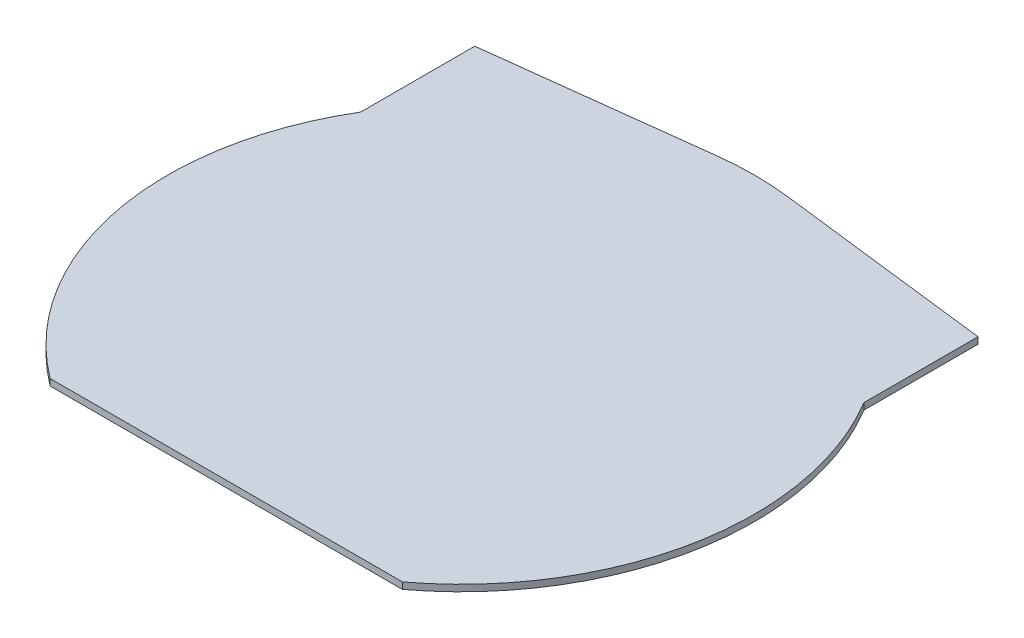
ISO-10303-21;
HEADER;
FILE_DESCRIPTION(('STEP AP214'),'2;1');
FILE_NAME('part.step','',(''),(''),'','','');
FILE_SCHEMA(('AUTOMOTIVE_DESIGN { 1 0 10303 214 1 1 1 1 }'));
ENDSEC;
DATA;
#1=APPLICATION_CONTEXT('core data for automotive mechanical design processes');
#2=APPLICATION_PROTOCOL_DEFINITION('international standard','automotive_design',2000,#1);
#3=PRODUCT_CONTEXT('',#1,'mechanical');
#4=PRODUCT('Part','Part','',(#3));
#5=PRODUCT_RELATED_PRODUCT_CATEGORY('part','',(#4));
#6=PRODUCT_DEFINITION_FORMATION('','',#4);
#7=PRODUCT_DEFINITION_CONTEXT('part definition',#1,'design');
#8=PRODUCT_DEFINITION('design','',#6,#7);
#9=PRODUCT_DEFINITION_SHAPE('','',#8);
#10=(LENGTH_UNIT() NAMED_UNIT(*) SI_UNIT(.MILLI.,.METRE.));
#11=(NAMED_UNIT(*) PLANE_ANGLE_UNIT() SI_UNIT($,.RADIAN.));
#12=(NAMED_UNIT(*) SI_UNIT($,.STERADIAN.) SOLID_ANGLE_UNIT());
#13=UNCERTAINTY_MEASURE_WITH_UNIT(LENGTH_MEASURE(1.E-05),#10,'distance_accuracy_value','');
#14=(GEOMETRIC_REPRESENTATION_CONTEXT(3) GLOBAL_UNCERTAINTY_ASSIGNED_CONTEXT((#13)) GLOBAL_UNIT_ASSIGNED_CONTEXT((#10,
#11,#12)) REPRESENTATION_CONTEXT('',''));
#15=CARTESIAN_POINT('',(0.,0.,0.));
#16=DIRECTION('',(0.,0.,1.));
#17=DIRECTION('',(1.,0.,0.));
#18=AXIS2_PLACEMENT_3D('',#15,#16,#17);
#19=CARTESIAN_POINT('',(0.,1.,0.));
#20=DIRECTION('',(0.,-1.,0.));
#21=DIRECTION('',(0.,0.,-1.));
#22=AXIS2_PLACEMENT_3D('',#19,#20,#21);
#23=CYLINDRICAL_SURFACE('',#22,90.);
#24=CARTESIAN_POINT('',(0.,1.,0.));
#25=DIRECTION('',(0.,1.,0.));
#26=DIRECTION('',(0.,0.,1.));
#27=AXIS2_PLACEMENT_3D('',#24,#25,#26);
#28=CIRCLE('',#27,90.);
#29=CARTESIAN_POINT('',(-77.1456828431538,1.,-46.3523852532264));
#30=VERTEX_POINT('',#29);
#31=CARTESIAN_POINT('',(-54.,1.,72.));
#32=VERTEX_POINT('',#31);
#33=EDGE_CURVE('E134',#30,#32,#28,.T.);
#34=ORIENTED_EDGE('',*,*,#33,.F.);
#35=DIRECTION('',(0.,-1.,0.));
#36=VECTOR('',#35,1.);
#37=CARTESIAN_POINT('',(-77.1456828431538,1.,-46.3523852532264));
#38=LINE('',#37,#36);
#39=CARTESIAN_POINT('',(-77.1456828431538,-1.,-46.3523852532264));
#40=VERTEX_POINT('',#39);
#41=EDGE_CURVE('E125',#30,#40,#38,.T.);
#42=ORIENTED_EDGE('',*,*,#41,.T.);
#43=CARTESIAN_POINT('',(0.,-1.,0.));
#44=DIRECTION('',(0.,1.,0.));
#45=DIRECTION('',(0.,0.,1.));
#46=AXIS2_PLACEMENT_3D('',#43,#44,#45);
#47=CIRCLE('',#46,90.);
#48=CARTESIAN_POINT('',(-54.,-1.,72.));
#49=VERTEX_POINT('',#48);
#50=EDGE_CURVE('E128',#40,#49,#47,.T.);
#51=ORIENTED_EDGE('',*,*,#50,.T.);
#52=DIRECTION('',(0.,-1.,0.));
#53=VECTOR('',#52,1.);
#54=CARTESIAN_POINT('',(-54.,1.,72.));
#55=LINE('',#54,#53);
#56=EDGE_CURVE('E143',#32,#49,#55,.T.);
#57=ORIENTED_EDGE('',*,*,#56,.F.);
#58=EDGE_LOOP('',(#34,#42,#51,#57));
#59=FACE_BOUND('',#58,.T.);
#60=ADVANCED_FACE('F35',(#59),#23,.T.);
#61=CARTESIAN_POINT('',(10.8516103197565,1.,-89.3433968095469));
#62=VERTEX_POINT('',#61);
#63=CARTESIAN_POINT('',(-10.8516103197565,1.,-89.3433968095469));
#64=VERTEX_POINT('',#63);
#65=EDGE_CURVE('E133',#62,#64,#28,.T.);
#66=ORIENTED_EDGE('',*,*,#65,.F.);
#67=DIRECTION('',(0.,-1.,0.));
#68=VECTOR('',#67,1.);
#69=CARTESIAN_POINT('',(10.8516103197565,1.,-89.3433968095469));
#70=LINE('',#69,#68);
#71=CARTESIAN_POINT('',(10.8516103197565,-1.,-89.3433968095469));
#72=VERTEX_POINT('',#71);
#73=EDGE_CURVE('E106',#62,#72,#70,.T.);
#74=ORIENTED_EDGE('',*,*,#73,.T.);
#75=CARTESIAN_POINT('',(-10.8516103197565,-1.,-89.3433968095469));
#76=VERTEX_POINT('',#75);
#77=EDGE_CURVE('E104',#72,#76,#47,.T.);
#78=ORIENTED_EDGE('',*,*,#77,.T.);
#79=DIRECTION('',(0.,-1.,0.));
#80=VECTOR('',#79,1.);
#81=CARTESIAN_POINT('',(-10.8516103197565,1.,-89.3433968095469));
#82=LINE('',#81,#80);
#83=EDGE_CURVE('E146',#76,#64,#82,.F.);
#84=ORIENTED_EDGE('',*,*,#83,.T.);
#85=EDGE_LOOP('',(#66,#74,#78,#84));
#86=FACE_BOUND('',#85,.T.);
#87=ADVANCED_FACE('F165',(#86),#23,.T.);
#88=CARTESIAN_POINT('',(54.,-1.,72.));
#89=VERTEX_POINT('',#88);
#90=CARTESIAN_POINT('',(77.1456828431538,-1.,-46.3523852532264));
#91=VERTEX_POINT('',#90);
#92=EDGE_CURVE('E137',#89,#91,#47,.T.);
#93=ORIENTED_EDGE('',*,*,#92,.T.);
#94=DIRECTION('',(0.,-1.,0.));
#95=VECTOR('',#94,1.);
#96=CARTESIAN_POINT('',(77.1456828431538,1.,-46.3523852532264));
#97=LINE('',#96,#95);
#98=CARTESIAN_POINT('',(77.1456828431538,1.,-46.3523852532264));
#99=VERTEX_POINT('',#98);
#100=EDGE_CURVE('E114',#91,#99,#97,.F.);
#101=ORIENTED_EDGE('',*,*,#100,.T.);
#102=CARTESIAN_POINT('',(54.,1.,72.));
#103=VERTEX_POINT('',#102);
#104=EDGE_CURVE('E129',#103,#99,#28,.T.);
#105=ORIENTED_EDGE('',*,*,#104,.F.);
#106=DIRECTION('',(0.,-1.,0.));
#107=VECTOR('',#106,1.);
#108=CARTESIAN_POINT('',(54.,1.,72.));
#109=LINE('',#108,#107);
#110=EDGE_CURVE('E136',#103,#89,#109,.T.);
#111=ORIENTED_EDGE('',*,*,#110,.T.);
#112=EDGE_LOOP('',(#93,#101,#105,#111));
#113=FACE_BOUND('',#112,.T.);
#114=ADVANCED_FACE('F176',(#113),#23,.T.);
#115=CARTESIAN_POINT('',(-54.,1.,72.));
#116=DIRECTION('',(0.,0.,-1.));
#117=DIRECTION('',(-1.,0.,0.));
#118=AXIS2_PLACEMENT_3D('',#115,#116,#117);
#119=PLANE('',#118);
#120=DIRECTION('',(1.,0.,0.));
#121=VECTOR('',#120,1.);
#122=CARTESIAN_POINT('',(-54.,-1.,72.));
#123=LINE('',#122,#121);
#124=EDGE_CURVE('E139',#49,#89,#123,.T.);
#125=ORIENTED_EDGE('',*,*,#124,.T.);
#126=ORIENTED_EDGE('',*,*,#110,.F.);
#127=DIRECTION('',(1.,0.,0.));
#128=VECTOR('',#127,1.);
#129=CARTESIAN_POINT('',(-54.,1.,72.));
#130=LINE('',#129,#128);
#131=EDGE_CURVE('E132',#32,#103,#130,.T.);
#132=ORIENTED_EDGE('',*,*,#131,.F.);
#133=ORIENTED_EDGE('',*,*,#56,.T.);
#134=EDGE_LOOP('',(#125,#126,#132,#133));
#135=FACE_BOUND('',#134,.T.);
#136=ADVANCED_FACE('F173',(#135),#119,.F.);
#137=CARTESIAN_POINT('',(0.,1.,0.));
#138=DIRECTION('',(0.,1.,0.));
#139=DIRECTION('',(0.,0.,1.));
#140=AXIS2_PLACEMENT_3D('',#137,#138,#139);
#141=PLANE('',#140);
#142=ORIENTED_EDGE('',*,*,#104,.T.);
#143=DIRECTION('',(0.,0.,-1.));
#144=VECTOR('',#143,1.);
#145=CARTESIAN_POINT('',(77.1456828431538,1.,-81.328780021929));
#146=LINE('',#145,#144);
#147=CARTESIAN_POINT('',(77.1456828431538,1.,-81.328780021929));
#148=VERTEX_POINT('',#147);
#149=EDGE_CURVE('E162',#99,#148,#146,.T.);
#150=ORIENTED_EDGE('',*,*,#149,.T.);
#151=CARTESIAN_POINT('',(7245.25849015743,1.,-59651.6079365075));
#152=DIRECTION('',(0.,1.,0.));
#153=DIRECTION('',(0.,0.,1.));
#154=AXIS2_PLACEMENT_3D('',#151,#152,#153);
#155=CIRCLE('',#154,60000.);
#156=EDGE_CURVE('E105',#148,#62,#155,.F.);
#157=ORIENTED_EDGE('',*,*,#156,.T.);
#158=ORIENTED_EDGE('',*,*,#65,.T.);
#159=CARTESIAN_POINT('',(-7245.25849015743,1.,-59651.6079365075));
#160=DIRECTION('',(0.,1.,0.));
#161=DIRECTION('',(0.,0.,1.));
#162=AXIS2_PLACEMENT_3D('',#159,#160,#161);
#163=CIRCLE('',#162,60000.);
#164=CARTESIAN_POINT('',(-77.1456828431538,1.,-81.328780021929));
#165=VERTEX_POINT('',#164);
#166=EDGE_CURVE('E43',#64,#165,#163,.F.);
#167=ORIENTED_EDGE('',*,*,#166,.T.);
#168=DIRECTION('',(0.,0.,1.));
#169=VECTOR('',#168,1.);
#170=CARTESIAN_POINT('',(-77.1456828431538,1.,-81.328780021929));
#171=LINE('',#170,#169);
#172=EDGE_CURVE('E154',#165,#30,#171,.T.);
#173=ORIENTED_EDGE('',*,*,#172,.T.);
#174=ORIENTED_EDGE('',*,*,#33,.T.);
#175=ORIENTED_EDGE('',*,*,#131,.T.);
#176=EDGE_LOOP('',(#142,#150,#157,#158,#167,#173,#174,#175));
#177=FACE_BOUND('',#176,.T.);
#178=ADVANCED_FACE('F153',(#177),#141,.T.);
#179=CARTESIAN_POINT('',(0.,-1.,0.));
#180=DIRECTION('',(0.,1.,0.));
#181=DIRECTION('',(0.,0.,1.));
#182=AXIS2_PLACEMENT_3D('',#179,#180,#181);
#183=PLANE('',#182);
#184=ORIENTED_EDGE('',*,*,#77,.F.);
#185=CARTESIAN_POINT('',(7245.25849015743,-1.,-59651.6079365075));
#186=DIRECTION('',(0.,1.,0.));
#187=DIRECTION('',(0.,0.,1.));
#188=AXIS2_PLACEMENT_3D('',#185,#186,#187);
#189=CIRCLE('',#188,60000.);
#190=CARTESIAN_POINT('',(77.1456828431538,-1.,-81.328780021929));
#191=VERTEX_POINT('',#190);
#192=EDGE_CURVE('E56',#72,#191,#189,.T.);
#193=ORIENTED_EDGE('',*,*,#192,.T.);
#194=DIRECTION('',(0.,0.,-1.));
#195=VECTOR('',#194,1.);
#196=CARTESIAN_POINT('',(77.1456828431538,-1.,-81.328780021929));
#197=LINE('',#196,#195);
#198=EDGE_CURVE('E102',#91,#191,#197,.T.);
#199=ORIENTED_EDGE('',*,*,#198,.F.);
#200=ORIENTED_EDGE('',*,*,#92,.F.);
#201=ORIENTED_EDGE('',*,*,#124,.F.);
#202=ORIENTED_EDGE('',*,*,#50,.F.);
#203=DIRECTION('',(0.,0.,1.));
#204=VECTOR('',#203,1.);
#205=CARTESIAN_POINT('',(-77.1456828431538,-1.,-81.328780021929));
#206=LINE('',#205,#204);
#207=CARTESIAN_POINT('',(-77.1456828431538,-1.,-81.328780021929));
#208=VERTEX_POINT('',#207);
#209=EDGE_CURVE('E115',#208,#40,#206,.T.);
#210=ORIENTED_EDGE('',*,*,#209,.F.);
#211=CARTESIAN_POINT('',(-7245.25849015743,-1.,-59651.6079365075));
#212=DIRECTION('',(0.,1.,0.));
#213=DIRECTION('',(0.,0.,1.));
#214=AXIS2_PLACEMENT_3D('',#211,#212,#213);
#215=CIRCLE('',#214,60000.);
#216=EDGE_CURVE('E11',#208,#76,#215,.T.);
#217=ORIENTED_EDGE('',*,*,#216,.T.);
#218=EDGE_LOOP('',(#184,#193,#199,#200,#201,#202,#210,#217));
#219=FACE_BOUND('',#218,.T.);
#220=ADVANCED_FACE('F100',(#219),#183,.F.);
#221=CARTESIAN_POINT('',(-77.1456828431538,-1.,-81.328780021929));
#222=DIRECTION('',(-1.,0.,0.));
#223=DIRECTION('',(0.,0.,1.));
#224=AXIS2_PLACEMENT_3D('',#221,#222,#223);
#225=PLANE('',#224);
#226=ORIENTED_EDGE('',*,*,#41,.F.);
#227=ORIENTED_EDGE('',*,*,#172,.F.);
#228=DIRECTION('',(0.,1.,0.));
#229=VECTOR('',#228,1.);
#230=CARTESIAN_POINT('',(-77.1456828431538,-1.,-81.328780021929));
#231=LINE('',#230,#229);
#232=EDGE_CURVE('E118',#208,#165,#231,.T.);
#233=ORIENTED_EDGE('',*,*,#232,.F.);
#234=ORIENTED_EDGE('',*,*,#209,.T.);
#235=EDGE_LOOP('',(#226,#227,#233,#234));
#236=FACE_BOUND('',#235,.T.);
#237=ADVANCED_FACE('F160',(#236),#225,.T.);
#238=CARTESIAN_POINT('',(77.1456828431538,-1.,-81.328780021929));
#239=DIRECTION('',(1.,0.,0.));
#240=DIRECTION('',(0.,0.,-1.));
#241=AXIS2_PLACEMENT_3D('',#238,#239,#240);
#242=PLANE('',#241);
#243=ORIENTED_EDGE('',*,*,#100,.F.);
#244=ORIENTED_EDGE('',*,*,#198,.T.);
#245=DIRECTION('',(0.,1.,0.));
#246=VECTOR('',#245,1.);
#247=CARTESIAN_POINT('',(77.1456828431538,-1.,-81.328780021929));
#248=LINE('',#247,#246);
#249=EDGE_CURVE('E111',#191,#148,#248,.T.);
#250=ORIENTED_EDGE('',*,*,#249,.T.);
#251=ORIENTED_EDGE('',*,*,#149,.F.);
#252=EDGE_LOOP('',(#243,#244,#250,#251));
#253=FACE_BOUND('',#252,.T.);
#254=ADVANCED_FACE('F110',(#253),#242,.T.);
#255=CARTESIAN_POINT('',(7245.25849015743,-1.,-59651.6079365075));
#256=DIRECTION('',(0.,1.,0.));
#257=DIRECTION('',(0.,0.,1.));
#258=AXIS2_PLACEMENT_3D('',#255,#256,#257);
#259=CYLINDRICAL_SURFACE('',#258,60000.);
#260=ORIENTED_EDGE('',*,*,#156,.F.);
#261=ORIENTED_EDGE('',*,*,#249,.F.);
#262=ORIENTED_EDGE('',*,*,#192,.F.);
#263=ORIENTED_EDGE('',*,*,#73,.F.);
#264=EDGE_LOOP('',(#260,#261,#262,#263));
#265=FACE_BOUND('',#264,.T.);
#266=ADVANCED_FACE('F117',(#265),#259,.F.);
#267=CARTESIAN_POINT('',(-7245.25849015743,-1.,-59651.6079365075));
#268=DIRECTION('',(0.,-1.,0.));
#269=DIRECTION('',(0.,0.,-1.));
#270=AXIS2_PLACEMENT_3D('',#267,#268,#269);
#271=CYLINDRICAL_SURFACE('',#270,60000.);
#272=ORIENTED_EDGE('',*,*,#216,.F.);
#273=ORIENTED_EDGE('',*,*,#232,.T.);
#274=ORIENTED_EDGE('',*,*,#166,.F.);
#275=ORIENTED_EDGE('',*,*,#83,.F.);
#276=EDGE_LOOP('',(#272,#273,#274,#275));
#277=FACE_BOUND('',#276,.T.);
#278=ADVANCED_FACE('F37',(#277),#271,.F.);
#279=CLOSED_SHELL('',(#60,#87,#114,#136,#178,#220,#237,#254,#266,#278));
#280=MANIFOLD_SOLID_BREP('B2',#279);
#281=ADVANCED_BREP_SHAPE_REPRESENTATION('',(#18,#280),#14);
#282=SHAPE_DEFINITION_REPRESENTATION(#9,#281);
ENDSEC;
END-ISO-10303-21;
